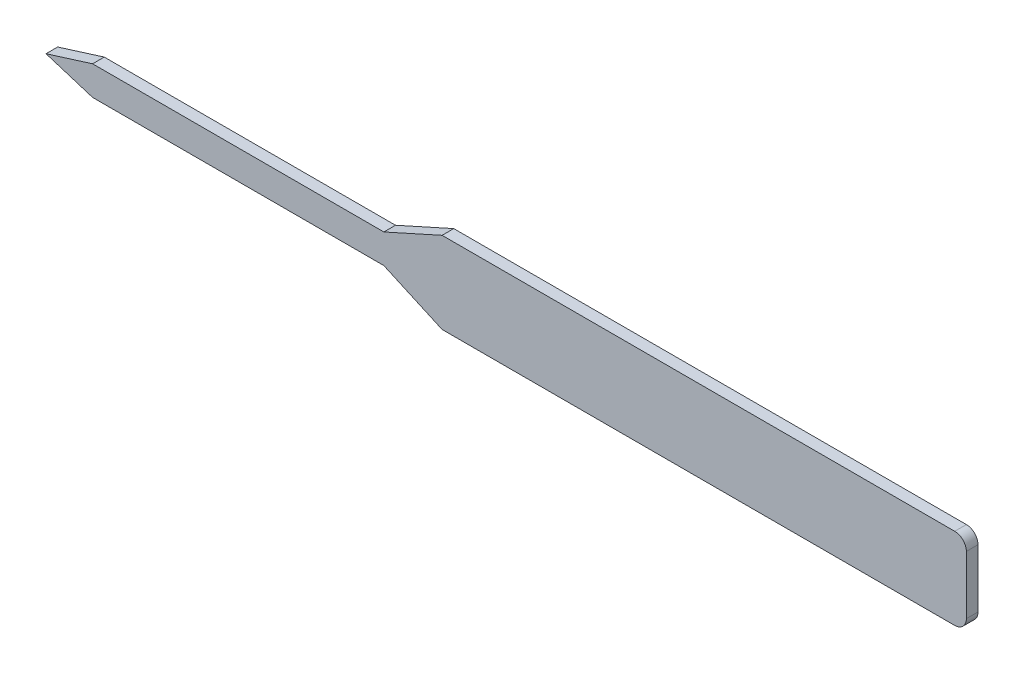
ISO-10303-21;
HEADER;
FILE_DESCRIPTION(('STEP AP214'),'2;1');
FILE_NAME('part.step','',(''),(''),'','','');
FILE_SCHEMA(('AUTOMOTIVE_DESIGN { 1 0 10303 214 1 1 1 1 }'));
ENDSEC;
DATA;
#1=APPLICATION_CONTEXT('core data for automotive mechanical design processes');
#2=APPLICATION_PROTOCOL_DEFINITION('international standard','automotive_design',2000,#1);
#3=PRODUCT_CONTEXT('',#1,'mechanical');
#4=PRODUCT('Part','Part','',(#3));
#5=PRODUCT_RELATED_PRODUCT_CATEGORY('part','',(#4));
#6=PRODUCT_DEFINITION_FORMATION('','',#4);
#7=PRODUCT_DEFINITION_CONTEXT('part definition',#1,'design');
#8=PRODUCT_DEFINITION('design','',#6,#7);
#9=PRODUCT_DEFINITION_SHAPE('','',#8);
#10=(LENGTH_UNIT() NAMED_UNIT(*) SI_UNIT(.MILLI.,.METRE.));
#11=(NAMED_UNIT(*) PLANE_ANGLE_UNIT() SI_UNIT($,.RADIAN.));
#12=(NAMED_UNIT(*) SI_UNIT($,.STERADIAN.) SOLID_ANGLE_UNIT());
#13=UNCERTAINTY_MEASURE_WITH_UNIT(LENGTH_MEASURE(1.E-05),#10,'distance_accuracy_value','');
#14=(GEOMETRIC_REPRESENTATION_CONTEXT(3) GLOBAL_UNCERTAINTY_ASSIGNED_CONTEXT((#13)) GLOBAL_UNIT_ASSIGNED_CONTEXT((#10,
#11,#12)) REPRESENTATION_CONTEXT('',''));
#15=CARTESIAN_POINT('',(0.,0.,0.));
#16=DIRECTION('',(0.,0.,1.));
#17=DIRECTION('',(1.,0.,0.));
#18=AXIS2_PLACEMENT_3D('',#15,#16,#17);
#19=CARTESIAN_POINT('',(45.,7.,2.));
#20=DIRECTION('',(-1.,0.,0.));
#21=DIRECTION('',(0.,0.,1.));
#22=AXIS2_PLACEMENT_3D('',#19,#20,#21);
#23=PLANE('',#22);
#24=DIRECTION('',(0.,1.,0.));
#25=VECTOR('',#24,1.);
#26=CARTESIAN_POINT('',(45.,7.,2.));
#27=LINE('',#26,#25);
#28=CARTESIAN_POINT('',(45.,-5.,2.));
#29=VERTEX_POINT('',#28);
#30=CARTESIAN_POINT('',(45.,5.,2.));
#31=VERTEX_POINT('',#30);
#32=EDGE_CURVE('E124',#29,#31,#27,.T.);
#33=ORIENTED_EDGE('',*,*,#32,.F.);
#34=DIRECTION('',(0.,0.,-1.));
#35=VECTOR('',#34,1.);
#36=CARTESIAN_POINT('',(45.,-5.,2.));
#37=LINE('',#36,#35);
#38=CARTESIAN_POINT('',(45.,-5.,0.));
#39=VERTEX_POINT('',#38);
#40=EDGE_CURVE('E189',#29,#39,#37,.T.);
#41=ORIENTED_EDGE('',*,*,#40,.T.);
#42=DIRECTION('',(0.,1.,0.));
#43=VECTOR('',#42,1.);
#44=CARTESIAN_POINT('',(45.,7.,0.));
#45=LINE('',#44,#43);
#46=CARTESIAN_POINT('',(45.,5.,0.));
#47=VERTEX_POINT('',#46);
#48=EDGE_CURVE('E155',#39,#47,#45,.T.);
#49=ORIENTED_EDGE('',*,*,#48,.T.);
#50=DIRECTION('',(0.,0.,-1.));
#51=VECTOR('',#50,1.);
#52=CARTESIAN_POINT('',(45.,5.,2.));
#53=LINE('',#52,#51);
#54=EDGE_CURVE('E133',#47,#31,#53,.F.);
#55=ORIENTED_EDGE('',*,*,#54,.T.);
#56=EDGE_LOOP('',(#33,#41,#49,#55));
#57=FACE_BOUND('',#56,.T.);
#58=ADVANCED_FACE('F33',(#57),#23,.F.);
#59=CARTESIAN_POINT('',(-45.,7.,2.));
#60=DIRECTION('',(0.,-1.,0.));
#61=DIRECTION('',(0.,0.,-1.));
#62=AXIS2_PLACEMENT_3D('',#59,#60,#61);
#63=PLANE('',#62);
#64=DIRECTION('',(-1.,0.,0.));
#65=VECTOR('',#64,1.);
#66=CARTESIAN_POINT('',(-45.,7.,2.));
#67=LINE('',#66,#65);
#68=CARTESIAN_POINT('',(43.,7.,2.));
#69=VERTEX_POINT('',#68);
#70=CARTESIAN_POINT('',(-45.,7.,2.));
#71=VERTEX_POINT('',#70);
#72=EDGE_CURVE('E116',#69,#71,#67,.T.);
#73=ORIENTED_EDGE('',*,*,#72,.F.);
#74=DIRECTION('',(0.,0.,-1.));
#75=VECTOR('',#74,1.);
#76=CARTESIAN_POINT('',(43.,7.,2.));
#77=LINE('',#76,#75);
#78=CARTESIAN_POINT('',(43.,7.,0.));
#79=VERTEX_POINT('',#78);
#80=EDGE_CURVE('E11',#69,#79,#77,.T.);
#81=ORIENTED_EDGE('',*,*,#80,.T.);
#82=DIRECTION('',(-1.,0.,0.));
#83=VECTOR('',#82,1.);
#84=CARTESIAN_POINT('',(-45.,7.,0.));
#85=LINE('',#84,#83);
#86=CARTESIAN_POINT('',(-45.,7.,0.));
#87=VERTEX_POINT('',#86);
#88=EDGE_CURVE('E130',#79,#87,#85,.T.);
#89=ORIENTED_EDGE('',*,*,#88,.T.);
#90=DIRECTION('',(0.,0.,-1.));
#91=VECTOR('',#90,1.);
#92=CARTESIAN_POINT('',(-45.,7.,2.));
#93=LINE('',#92,#91);
#94=EDGE_CURVE('E127',#71,#87,#93,.T.);
#95=ORIENTED_EDGE('',*,*,#94,.F.);
#96=EDGE_LOOP('',(#73,#81,#89,#95));
#97=FACE_BOUND('',#96,.T.);
#98=ADVANCED_FACE('F128',(#97),#63,.F.);
#99=CARTESIAN_POINT('',(-45.,7.,2.));
#100=DIRECTION('',(0.410364677328798,-0.911921505175107,0.));
#101=DIRECTION('',(0.911921505175106,0.410364677328798,0.));
#102=AXIS2_PLACEMENT_3D('',#99,#100,#101);
#103=PLANE('',#102);
#104=DIRECTION('',(-0.911921505175106,-0.410364677328798,0.));
#105=VECTOR('',#104,1.);
#106=CARTESIAN_POINT('',(-45.,7.,0.));
#107=LINE('',#106,#105);
#108=CARTESIAN_POINT('',(-55.,2.5,0.));
#109=VERTEX_POINT('',#108);
#110=EDGE_CURVE('E159',#87,#109,#107,.T.);
#111=ORIENTED_EDGE('',*,*,#110,.T.);
#112=DIRECTION('',(0.,0.,-1.));
#113=VECTOR('',#112,1.);
#114=CARTESIAN_POINT('',(-55.,2.5,2.));
#115=LINE('',#114,#113);
#116=CARTESIAN_POINT('',(-55.,2.5,2.));
#117=VERTEX_POINT('',#116);
#118=EDGE_CURVE('E134',#117,#109,#115,.T.);
#119=ORIENTED_EDGE('',*,*,#118,.F.);
#120=DIRECTION('',(-0.911921505175106,-0.410364677328798,0.));
#121=VECTOR('',#120,1.);
#122=CARTESIAN_POINT('',(-45.,7.,2.));
#123=LINE('',#122,#121);
#124=EDGE_CURVE('E120',#71,#117,#123,.T.);
#125=ORIENTED_EDGE('',*,*,#124,.F.);
#126=ORIENTED_EDGE('',*,*,#94,.T.);
#127=EDGE_LOOP('',(#111,#119,#125,#126));
#128=FACE_BOUND('',#127,.T.);
#129=ADVANCED_FACE('F136',(#128),#103,.F.);
#130=CARTESIAN_POINT('',(-105.,2.5,2.));
#131=DIRECTION('',(0.,-1.,0.));
#132=DIRECTION('',(1.,0.,0.));
#133=AXIS2_PLACEMENT_3D('',#130,#131,#132);
#134=PLANE('',#133);
#135=DIRECTION('',(-1.,0.,0.));
#136=VECTOR('',#135,1.);
#137=CARTESIAN_POINT('',(-105.,2.5,0.));
#138=LINE('',#137,#136);
#139=CARTESIAN_POINT('',(-105.,2.5,0.));
#140=VERTEX_POINT('',#139);
#141=EDGE_CURVE('E161',#109,#140,#138,.T.);
#142=ORIENTED_EDGE('',*,*,#141,.T.);
#143=DIRECTION('',(0.,0.,-1.));
#144=VECTOR('',#143,1.);
#145=CARTESIAN_POINT('',(-105.,2.5,2.));
#146=LINE('',#145,#144);
#147=CARTESIAN_POINT('',(-105.,2.5,2.));
#148=VERTEX_POINT('',#147);
#149=EDGE_CURVE('E184',#148,#140,#146,.T.);
#150=ORIENTED_EDGE('',*,*,#149,.F.);
#151=DIRECTION('',(-1.,0.,0.));
#152=VECTOR('',#151,1.);
#153=CARTESIAN_POINT('',(-105.,2.5,2.));
#154=LINE('',#153,#152);
#155=EDGE_CURVE('E139',#117,#148,#154,.T.);
#156=ORIENTED_EDGE('',*,*,#155,.F.);
#157=ORIENTED_EDGE('',*,*,#118,.T.);
#158=EDGE_LOOP('',(#142,#150,#156,#157));
#159=FACE_BOUND('',#158,.T.);
#160=ADVANCED_FACE('F232',(#159),#134,.F.);
#161=CARTESIAN_POINT('',(-105.,2.5,2.));
#162=DIRECTION('',(0.298274993135947,-0.95447997803503,0.));
#163=DIRECTION('',(0.95447997803503,0.298274993135947,0.));
#164=AXIS2_PLACEMENT_3D('',#161,#162,#163);
#165=PLANE('',#164);
#166=DIRECTION('',(-0.95447997803503,-0.298274993135947,0.));
#167=VECTOR('',#166,1.);
#168=CARTESIAN_POINT('',(-105.,2.5,0.));
#169=LINE('',#168,#167);
#170=CARTESIAN_POINT('',(-113.,0.,0.));
#171=VERTEX_POINT('',#170);
#172=EDGE_CURVE('E163',#140,#171,#169,.T.);
#173=ORIENTED_EDGE('',*,*,#172,.T.);
#174=DIRECTION('',(0.,0.,-1.));
#175=VECTOR('',#174,1.);
#176=CARTESIAN_POINT('',(-113.,0.,2.));
#177=LINE('',#176,#175);
#178=CARTESIAN_POINT('',(-113.,0.,2.));
#179=VERTEX_POINT('',#178);
#180=EDGE_CURVE('E181',#179,#171,#177,.T.);
#181=ORIENTED_EDGE('',*,*,#180,.F.);
#182=DIRECTION('',(-0.95447997803503,-0.298274993135947,0.));
#183=VECTOR('',#182,1.);
#184=CARTESIAN_POINT('',(-105.,2.5,2.));
#185=LINE('',#184,#183);
#186=EDGE_CURVE('E141',#148,#179,#185,.T.);
#187=ORIENTED_EDGE('',*,*,#186,.F.);
#188=ORIENTED_EDGE('',*,*,#149,.T.);
#189=EDGE_LOOP('',(#173,#181,#187,#188));
#190=FACE_BOUND('',#189,.T.);
#191=ADVANCED_FACE('F228',(#190),#165,.F.);
#192=CARTESIAN_POINT('',(-113.,0.,2.));
#193=DIRECTION('',(0.298274993135946,0.95447997803503,0.));
#194=DIRECTION('',(-0.95447997803503,0.298274993135946,0.));
#195=AXIS2_PLACEMENT_3D('',#192,#193,#194);
#196=PLANE('',#195);
#197=DIRECTION('',(0.95447997803503,-0.298274993135946,0.));
#198=VECTOR('',#197,1.);
#199=CARTESIAN_POINT('',(-113.,0.,0.));
#200=LINE('',#199,#198);
#201=CARTESIAN_POINT('',(-105.,-2.5,0.));
#202=VERTEX_POINT('',#201);
#203=EDGE_CURVE('E165',#171,#202,#200,.T.);
#204=ORIENTED_EDGE('',*,*,#203,.T.);
#205=DIRECTION('',(0.,0.,-1.));
#206=VECTOR('',#205,1.);
#207=CARTESIAN_POINT('',(-105.,-2.5,2.));
#208=LINE('',#207,#206);
#209=CARTESIAN_POINT('',(-105.,-2.5,2.));
#210=VERTEX_POINT('',#209);
#211=EDGE_CURVE('E178',#210,#202,#208,.T.);
#212=ORIENTED_EDGE('',*,*,#211,.F.);
#213=DIRECTION('',(0.95447997803503,-0.298274993135946,0.));
#214=VECTOR('',#213,1.);
#215=CARTESIAN_POINT('',(-113.,0.,2.));
#216=LINE('',#215,#214);
#217=EDGE_CURVE('E146',#179,#210,#216,.T.);
#218=ORIENTED_EDGE('',*,*,#217,.F.);
#219=ORIENTED_EDGE('',*,*,#180,.T.);
#220=EDGE_LOOP('',(#204,#212,#218,#219));
#221=FACE_BOUND('',#220,.T.);
#222=ADVANCED_FACE('F224',(#221),#196,.F.);
#223=CARTESIAN_POINT('',(-105.,-2.5,2.));
#224=DIRECTION('',(0.,1.,0.));
#225=DIRECTION('',(-1.,0.,0.));
#226=AXIS2_PLACEMENT_3D('',#223,#224,#225);
#227=PLANE('',#226);
#228=DIRECTION('',(1.,0.,0.));
#229=VECTOR('',#228,1.);
#230=CARTESIAN_POINT('',(-105.,-2.5,0.));
#231=LINE('',#230,#229);
#232=CARTESIAN_POINT('',(-55.,-2.5,0.));
#233=VERTEX_POINT('',#232);
#234=EDGE_CURVE('E167',#202,#233,#231,.T.);
#235=ORIENTED_EDGE('',*,*,#234,.T.);
#236=DIRECTION('',(0.,0.,-1.));
#237=VECTOR('',#236,1.);
#238=CARTESIAN_POINT('',(-55.,-2.5,2.));
#239=LINE('',#238,#237);
#240=CARTESIAN_POINT('',(-55.,-2.5,2.));
#241=VERTEX_POINT('',#240);
#242=EDGE_CURVE('E175',#241,#233,#239,.T.);
#243=ORIENTED_EDGE('',*,*,#242,.F.);
#244=DIRECTION('',(1.,0.,0.));
#245=VECTOR('',#244,1.);
#246=CARTESIAN_POINT('',(-105.,-2.5,2.));
#247=LINE('',#246,#245);
#248=EDGE_CURVE('E148',#210,#241,#247,.T.);
#249=ORIENTED_EDGE('',*,*,#248,.F.);
#250=ORIENTED_EDGE('',*,*,#211,.T.);
#251=EDGE_LOOP('',(#235,#243,#249,#250));
#252=FACE_BOUND('',#251,.T.);
#253=ADVANCED_FACE('F219',(#252),#227,.F.);
#254=CARTESIAN_POINT('',(-55.,-2.5,2.));
#255=DIRECTION('',(0.410364677328798,0.911921505175106,0.));
#256=DIRECTION('',(-0.911921505175106,0.410364677328798,0.));
#257=AXIS2_PLACEMENT_3D('',#254,#255,#256);
#258=PLANE('',#257);
#259=DIRECTION('',(0.911921505175106,-0.410364677328798,0.));
#260=VECTOR('',#259,1.);
#261=CARTESIAN_POINT('',(-55.,-2.5,0.));
#262=LINE('',#261,#260);
#263=CARTESIAN_POINT('',(-45.,-7.,0.));
#264=VERTEX_POINT('',#263);
#265=EDGE_CURVE('E169',#233,#264,#262,.T.);
#266=ORIENTED_EDGE('',*,*,#265,.T.);
#267=DIRECTION('',(0.,0.,-1.));
#268=VECTOR('',#267,1.);
#269=CARTESIAN_POINT('',(-45.,-7.,2.));
#270=LINE('',#269,#268);
#271=CARTESIAN_POINT('',(-45.,-7.,2.));
#272=VERTEX_POINT('',#271);
#273=EDGE_CURVE('E154',#272,#264,#270,.T.);
#274=ORIENTED_EDGE('',*,*,#273,.F.);
#275=DIRECTION('',(0.911921505175106,-0.410364677328798,0.));
#276=VECTOR('',#275,1.);
#277=CARTESIAN_POINT('',(-55.,-2.5,2.));
#278=LINE('',#277,#276);
#279=EDGE_CURVE('E150',#241,#272,#278,.T.);
#280=ORIENTED_EDGE('',*,*,#279,.F.);
#281=ORIENTED_EDGE('',*,*,#242,.T.);
#282=EDGE_LOOP('',(#266,#274,#280,#281));
#283=FACE_BOUND('',#282,.T.);
#284=ADVANCED_FACE('F213',(#283),#258,.F.);
#285=CARTESIAN_POINT('',(-45.,-7.,2.));
#286=DIRECTION('',(0.,1.,0.));
#287=DIRECTION('',(0.,0.,1.));
#288=AXIS2_PLACEMENT_3D('',#285,#286,#287);
#289=PLANE('',#288);
#290=DIRECTION('',(1.,0.,0.));
#291=VECTOR('',#290,1.);
#292=CARTESIAN_POINT('',(-45.,-7.,0.));
#293=LINE('',#292,#291);
#294=CARTESIAN_POINT('',(43.,-7.,0.));
#295=VERTEX_POINT('',#294);
#296=EDGE_CURVE('E171',#264,#295,#293,.T.);
#297=ORIENTED_EDGE('',*,*,#296,.T.);
#298=DIRECTION('',(0.,0.,-1.));
#299=VECTOR('',#298,1.);
#300=CARTESIAN_POINT('',(43.,-7.,2.));
#301=LINE('',#300,#299);
#302=CARTESIAN_POINT('',(43.,-7.,2.));
#303=VERTEX_POINT('',#302);
#304=EDGE_CURVE('E56',#295,#303,#301,.F.);
#305=ORIENTED_EDGE('',*,*,#304,.T.);
#306=DIRECTION('',(1.,0.,0.));
#307=VECTOR('',#306,1.);
#308=CARTESIAN_POINT('',(-45.,-7.,2.));
#309=LINE('',#308,#307);
#310=EDGE_CURVE('E152',#272,#303,#309,.T.);
#311=ORIENTED_EDGE('',*,*,#310,.F.);
#312=ORIENTED_EDGE('',*,*,#273,.T.);
#313=EDGE_LOOP('',(#297,#305,#311,#312));
#314=FACE_BOUND('',#313,.T.);
#315=ADVANCED_FACE('F209',(#314),#289,.F.);
#316=CARTESIAN_POINT('',(0.,0.,2.));
#317=DIRECTION('',(0.,0.,1.));
#318=DIRECTION('',(1.,0.,0.));
#319=AXIS2_PLACEMENT_3D('',#316,#317,#318);
#320=PLANE('',#319);
#321=ORIENTED_EDGE('',*,*,#310,.T.);
#322=CARTESIAN_POINT('',(43.,-5.,2.));
#323=DIRECTION('',(0.,0.,1.));
#324=DIRECTION('',(1.,0.,0.));
#325=AXIS2_PLACEMENT_3D('',#322,#323,#324);
#326=CIRCLE('',#325,2.);
#327=EDGE_CURVE('E41',#303,#29,#326,.T.);
#328=ORIENTED_EDGE('',*,*,#327,.T.);
#329=ORIENTED_EDGE('',*,*,#32,.T.);
#330=CARTESIAN_POINT('',(43.,5.,2.));
#331=DIRECTION('',(0.,0.,1.));
#332=DIRECTION('',(1.,0.,0.));
#333=AXIS2_PLACEMENT_3D('',#330,#331,#332);
#334=CIRCLE('',#333,2.);
#335=EDGE_CURVE('E48',#31,#69,#334,.T.);
#336=ORIENTED_EDGE('',*,*,#335,.T.);
#337=ORIENTED_EDGE('',*,*,#72,.T.);
#338=ORIENTED_EDGE('',*,*,#124,.T.);
#339=ORIENTED_EDGE('',*,*,#155,.T.);
#340=ORIENTED_EDGE('',*,*,#186,.T.);
#341=ORIENTED_EDGE('',*,*,#217,.T.);
#342=ORIENTED_EDGE('',*,*,#248,.T.);
#343=ORIENTED_EDGE('',*,*,#279,.T.);
#344=EDGE_LOOP('',(#321,#328,#329,#336,#337,#338,#339,#340,#341,#342,#343));
#345=FACE_BOUND('',#344,.T.);
#346=ADVANCED_FACE('F118',(#345),#320,.T.);
#347=CARTESIAN_POINT('',(0.,0.,0.));
#348=DIRECTION('',(0.,0.,1.));
#349=DIRECTION('',(1.,0.,0.));
#350=AXIS2_PLACEMENT_3D('',#347,#348,#349);
#351=PLANE('',#350);
#352=ORIENTED_EDGE('',*,*,#48,.F.);
#353=CARTESIAN_POINT('',(43.,-5.,0.));
#354=DIRECTION('',(0.,0.,1.));
#355=DIRECTION('',(1.,0.,0.));
#356=AXIS2_PLACEMENT_3D('',#353,#354,#355);
#357=CIRCLE('',#356,2.);
#358=EDGE_CURVE('E194',#39,#295,#357,.F.);
#359=ORIENTED_EDGE('',*,*,#358,.T.);
#360=ORIENTED_EDGE('',*,*,#296,.F.);
#361=ORIENTED_EDGE('',*,*,#265,.F.);
#362=ORIENTED_EDGE('',*,*,#234,.F.);
#363=ORIENTED_EDGE('',*,*,#203,.F.);
#364=ORIENTED_EDGE('',*,*,#172,.F.);
#365=ORIENTED_EDGE('',*,*,#141,.F.);
#366=ORIENTED_EDGE('',*,*,#110,.F.);
#367=ORIENTED_EDGE('',*,*,#88,.F.);
#368=CARTESIAN_POINT('',(43.,5.,0.));
#369=DIRECTION('',(0.,0.,1.));
#370=DIRECTION('',(1.,0.,0.));
#371=AXIS2_PLACEMENT_3D('',#368,#369,#370);
#372=CIRCLE('',#371,2.);
#373=EDGE_CURVE('E192',#79,#47,#372,.F.);
#374=ORIENTED_EDGE('',*,*,#373,.T.);
#375=EDGE_LOOP('',(#352,#359,#360,#361,#362,#363,#364,#365,#366,#367,#374));
#376=FACE_BOUND('',#375,.T.);
#377=ADVANCED_FACE('F207',(#376),#351,.F.);
#378=CARTESIAN_POINT('',(43.,-5.,2.));
#379=DIRECTION('',(0.,0.,-1.));
#380=DIRECTION('',(-1.,0.,0.));
#381=AXIS2_PLACEMENT_3D('',#378,#379,#380);
#382=CYLINDRICAL_SURFACE('',#381,2.);
#383=ORIENTED_EDGE('',*,*,#327,.F.);
#384=ORIENTED_EDGE('',*,*,#304,.F.);
#385=ORIENTED_EDGE('',*,*,#358,.F.);
#386=ORIENTED_EDGE('',*,*,#40,.F.);
#387=EDGE_LOOP('',(#383,#384,#385,#386));
#388=FACE_BOUND('',#387,.T.);
#389=ADVANCED_FACE('F204',(#388),#382,.T.);
#390=CARTESIAN_POINT('',(43.,5.,2.));
#391=DIRECTION('',(0.,0.,-1.));
#392=DIRECTION('',(-1.,0.,0.));
#393=AXIS2_PLACEMENT_3D('',#390,#391,#392);
#394=CYLINDRICAL_SURFACE('',#393,2.);
#395=ORIENTED_EDGE('',*,*,#335,.F.);
#396=ORIENTED_EDGE('',*,*,#54,.F.);
#397=ORIENTED_EDGE('',*,*,#373,.F.);
#398=ORIENTED_EDGE('',*,*,#80,.F.);
#399=EDGE_LOOP('',(#395,#396,#397,#398));
#400=FACE_BOUND('',#399,.T.);
#401=ADVANCED_FACE('F35',(#400),#394,.T.);
#402=CLOSED_SHELL('',(#58,#98,#129,#160,#191,#222,#253,#284,#315,#346,#377,#389,#401));
#403=MANIFOLD_SOLID_BREP('B2',#402);
#404=ADVANCED_BREP_SHAPE_REPRESENTATION('',(#18,#403),#14);
#405=SHAPE_DEFINITION_REPRESENTATION(#9,#404);
ENDSEC;
END-ISO-10303-21;
